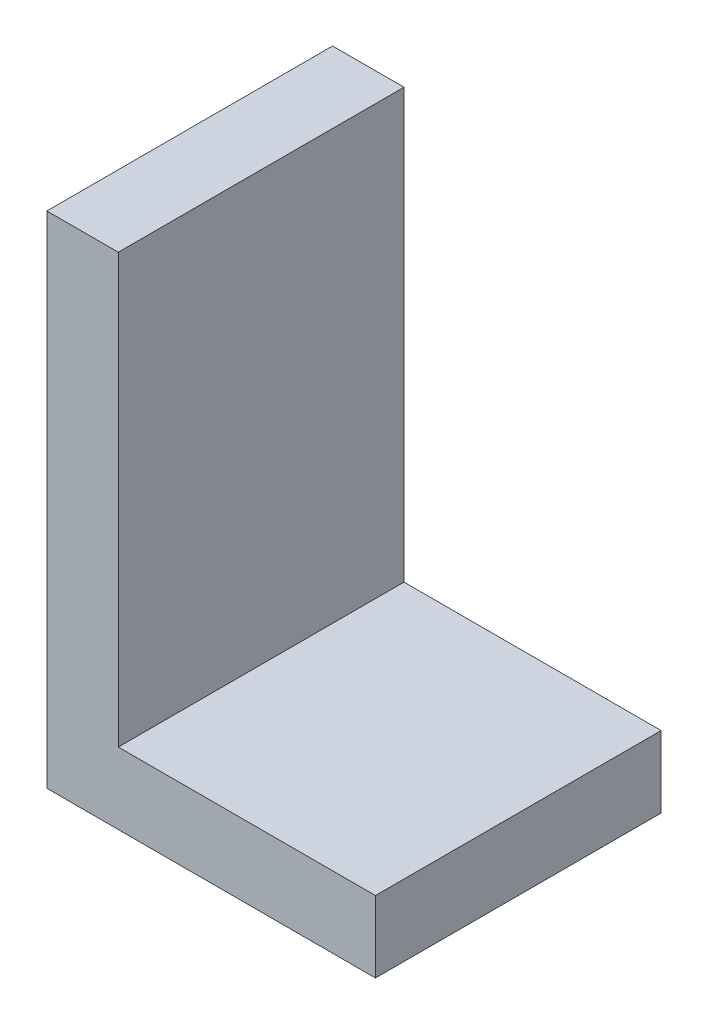
ISO-10303-21;
HEADER;
FILE_DESCRIPTION(('STEP AP214'),'2;1');
FILE_NAME('part.step','',(''),(''),'','','');
FILE_SCHEMA(('AUTOMOTIVE_DESIGN { 1 0 10303 214 1 1 1 1 }'));
ENDSEC;
DATA;
#1=APPLICATION_CONTEXT('core data for automotive mechanical design processes');
#2=APPLICATION_PROTOCOL_DEFINITION('international standard','automotive_design',2000,#1);
#3=PRODUCT_CONTEXT('',#1,'mechanical');
#4=PRODUCT('Part','Part','',(#3));
#5=PRODUCT_RELATED_PRODUCT_CATEGORY('part','',(#4));
#6=PRODUCT_DEFINITION_FORMATION('','',#4);
#7=PRODUCT_DEFINITION_CONTEXT('part definition',#1,'design');
#8=PRODUCT_DEFINITION('design','',#6,#7);
#9=PRODUCT_DEFINITION_SHAPE('','',#8);
#10=(LENGTH_UNIT() NAMED_UNIT(*) SI_UNIT(.MILLI.,.METRE.));
#11=(NAMED_UNIT(*) PLANE_ANGLE_UNIT() SI_UNIT($,.RADIAN.));
#12=(NAMED_UNIT(*) SI_UNIT($,.STERADIAN.) SOLID_ANGLE_UNIT());
#13=UNCERTAINTY_MEASURE_WITH_UNIT(LENGTH_MEASURE(1.E-05),#10,'distance_accuracy_value','');
#14=(GEOMETRIC_REPRESENTATION_CONTEXT(3) GLOBAL_UNCERTAINTY_ASSIGNED_CONTEXT((#13)) GLOBAL_UNIT_ASSIGNED_CONTEXT((#10,
#11,#12)) REPRESENTATION_CONTEXT('',''));
#15=CARTESIAN_POINT('',(0.,0.,0.));
#16=DIRECTION('',(0.,0.,1.));
#17=DIRECTION('',(1.,0.,0.));
#18=AXIS2_PLACEMENT_3D('',#15,#16,#17);
#19=CARTESIAN_POINT('',(460.,0.,400.));
#20=DIRECTION('',(0.,1.,0.));
#21=DIRECTION('',(-1.,0.,0.));
#22=AXIS2_PLACEMENT_3D('',#19,#20,#21);
#23=PLANE('',#22);
#24=DIRECTION('',(1.,0.,0.));
#25=VECTOR('',#24,1.);
#26=CARTESIAN_POINT('',(460.,0.,0.));
#27=LINE('',#26,#25);
#28=CARTESIAN_POINT('',(0.,0.,0.));
#29=VERTEX_POINT('',#28);
#30=CARTESIAN_POINT('',(460.,0.,0.));
#31=VERTEX_POINT('',#30);
#32=EDGE_CURVE('E117',#29,#31,#27,.T.);
#33=ORIENTED_EDGE('',*,*,#32,.T.);
#34=DIRECTION('',(0.,0.,-1.));
#35=VECTOR('',#34,1.);
#36=CARTESIAN_POINT('',(460.,0.,400.));
#37=LINE('',#36,#35);
#38=CARTESIAN_POINT('',(460.,0.,400.));
#39=VERTEX_POINT('',#38);
#40=EDGE_CURVE('E11',#39,#31,#37,.T.);
#41=ORIENTED_EDGE('',*,*,#40,.F.);
#42=DIRECTION('',(1.,0.,0.));
#43=VECTOR('',#42,1.);
#44=CARTESIAN_POINT('',(460.,0.,400.));
#45=LINE('',#44,#43);
#46=CARTESIAN_POINT('',(0.,0.,400.));
#47=VERTEX_POINT('',#46);
#48=EDGE_CURVE('E127',#47,#39,#45,.T.);
#49=ORIENTED_EDGE('',*,*,#48,.F.);
#50=DIRECTION('',(0.,0.,-1.));
#51=VECTOR('',#50,1.);
#52=CARTESIAN_POINT('',(0.,0.,400.));
#53=LINE('',#52,#51);
#54=EDGE_CURVE('E113',#47,#29,#53,.T.);
#55=ORIENTED_EDGE('',*,*,#54,.T.);
#56=EDGE_LOOP('',(#33,#41,#49,#55));
#57=FACE_BOUND('',#56,.T.);
#58=ADVANCED_FACE('F33',(#57),#23,.F.);
#59=CARTESIAN_POINT('',(460.,100.,400.));
#60=DIRECTION('',(-1.,0.,0.));
#61=DIRECTION('',(0.,0.,1.));
#62=AXIS2_PLACEMENT_3D('',#59,#60,#61);
#63=PLANE('',#62);
#64=DIRECTION('',(0.,1.,0.));
#65=VECTOR('',#64,1.);
#66=CARTESIAN_POINT('',(460.,100.,0.));
#67=LINE('',#66,#65);
#68=CARTESIAN_POINT('',(460.,100.,0.));
#69=VERTEX_POINT('',#68);
#70=EDGE_CURVE('E120',#31,#69,#67,.T.);
#71=ORIENTED_EDGE('',*,*,#70,.T.);
#72=DIRECTION('',(0.,0.,-1.));
#73=VECTOR('',#72,1.);
#74=CARTESIAN_POINT('',(460.,100.,400.));
#75=LINE('',#74,#73);
#76=CARTESIAN_POINT('',(460.,100.,400.));
#77=VERTEX_POINT('',#76);
#78=EDGE_CURVE('E41',#77,#69,#75,.T.);
#79=ORIENTED_EDGE('',*,*,#78,.F.);
#80=DIRECTION('',(0.,1.,0.));
#81=VECTOR('',#80,1.);
#82=CARTESIAN_POINT('',(460.,100.,400.));
#83=LINE('',#82,#81);
#84=EDGE_CURVE('E86',#39,#77,#83,.T.);
#85=ORIENTED_EDGE('',*,*,#84,.F.);
#86=ORIENTED_EDGE('',*,*,#40,.T.);
#87=EDGE_LOOP('',(#71,#79,#85,#86));
#88=FACE_BOUND('',#87,.T.);
#89=ADVANCED_FACE('F151',(#88),#63,.F.);
#90=CARTESIAN_POINT('',(100.,100.,400.));
#91=DIRECTION('',(0.,-1.,0.));
#92=DIRECTION('',(0.,0.,-1.));
#93=AXIS2_PLACEMENT_3D('',#90,#91,#92);
#94=PLANE('',#93);
#95=DIRECTION('',(-1.,0.,0.));
#96=VECTOR('',#95,1.);
#97=CARTESIAN_POINT('',(100.,100.,0.));
#98=LINE('',#97,#96);
#99=CARTESIAN_POINT('',(100.,100.,0.));
#100=VERTEX_POINT('',#99);
#101=EDGE_CURVE('E122',#69,#100,#98,.T.);
#102=ORIENTED_EDGE('',*,*,#101,.T.);
#103=DIRECTION('',(0.,0.,-1.));
#104=VECTOR('',#103,1.);
#105=CARTESIAN_POINT('',(100.,100.,400.));
#106=LINE('',#105,#104);
#107=CARTESIAN_POINT('',(100.,100.,400.));
#108=VERTEX_POINT('',#107);
#109=EDGE_CURVE('E108',#108,#100,#106,.T.);
#110=ORIENTED_EDGE('',*,*,#109,.F.);
#111=DIRECTION('',(-1.,0.,0.));
#112=VECTOR('',#111,1.);
#113=CARTESIAN_POINT('',(100.,100.,400.));
#114=LINE('',#113,#112);
#115=EDGE_CURVE('E99',#77,#108,#114,.T.);
#116=ORIENTED_EDGE('',*,*,#115,.F.);
#117=ORIENTED_EDGE('',*,*,#78,.T.);
#118=EDGE_LOOP('',(#102,#110,#116,#117));
#119=FACE_BOUND('',#118,.T.);
#120=ADVANCED_FACE('F133',(#119),#94,.F.);
#121=CARTESIAN_POINT('',(100.,700.,400.));
#122=DIRECTION('',(-1.,0.,0.));
#123=DIRECTION('',(0.,-1.,0.));
#124=AXIS2_PLACEMENT_3D('',#121,#122,#123);
#125=PLANE('',#124);
#126=DIRECTION('',(0.,1.,0.));
#127=VECTOR('',#126,1.);
#128=CARTESIAN_POINT('',(100.,700.,0.));
#129=LINE('',#128,#127);
#130=CARTESIAN_POINT('',(100.,700.,0.));
#131=VERTEX_POINT('',#130);
#132=EDGE_CURVE('E107',#100,#131,#129,.T.);
#133=ORIENTED_EDGE('',*,*,#132,.T.);
#134=DIRECTION('',(0.,0.,-1.));
#135=VECTOR('',#134,1.);
#136=CARTESIAN_POINT('',(100.,700.,400.));
#137=LINE('',#136,#135);
#138=CARTESIAN_POINT('',(100.,700.,400.));
#139=VERTEX_POINT('',#138);
#140=EDGE_CURVE('E104',#139,#131,#137,.T.);
#141=ORIENTED_EDGE('',*,*,#140,.F.);
#142=DIRECTION('',(0.,1.,0.));
#143=VECTOR('',#142,1.);
#144=CARTESIAN_POINT('',(100.,700.,400.));
#145=LINE('',#144,#143);
#146=EDGE_CURVE('E93',#108,#139,#145,.T.);
#147=ORIENTED_EDGE('',*,*,#146,.F.);
#148=ORIENTED_EDGE('',*,*,#109,.T.);
#149=EDGE_LOOP('',(#133,#141,#147,#148));
#150=FACE_BOUND('',#149,.T.);
#151=ADVANCED_FACE('F105',(#150),#125,.F.);
#152=CARTESIAN_POINT('',(0.,700.,400.));
#153=DIRECTION('',(0.,-1.,0.));
#154=DIRECTION('',(0.,0.,-1.));
#155=AXIS2_PLACEMENT_3D('',#152,#153,#154);
#156=PLANE('',#155);
#157=DIRECTION('',(-1.,0.,0.));
#158=VECTOR('',#157,1.);
#159=CARTESIAN_POINT('',(0.,700.,0.));
#160=LINE('',#159,#158);
#161=CARTESIAN_POINT('',(0.,700.,0.));
#162=VERTEX_POINT('',#161);
#163=EDGE_CURVE('E72',#131,#162,#160,.T.);
#164=ORIENTED_EDGE('',*,*,#163,.T.);
#165=DIRECTION('',(0.,0.,-1.));
#166=VECTOR('',#165,1.);
#167=CARTESIAN_POINT('',(0.,700.,400.));
#168=LINE('',#167,#166);
#169=CARTESIAN_POINT('',(0.,700.,400.));
#170=VERTEX_POINT('',#169);
#171=EDGE_CURVE('E109',#170,#162,#168,.T.);
#172=ORIENTED_EDGE('',*,*,#171,.F.);
#173=DIRECTION('',(-1.,0.,0.));
#174=VECTOR('',#173,1.);
#175=CARTESIAN_POINT('',(0.,700.,400.));
#176=LINE('',#175,#174);
#177=EDGE_CURVE('E97',#139,#170,#176,.T.);
#178=ORIENTED_EDGE('',*,*,#177,.F.);
#179=ORIENTED_EDGE('',*,*,#140,.T.);
#180=EDGE_LOOP('',(#164,#172,#178,#179));
#181=FACE_BOUND('',#180,.T.);
#182=ADVANCED_FACE('F111',(#181),#156,.F.);
#183=CARTESIAN_POINT('',(0.,0.,400.));
#184=DIRECTION('',(1.,0.,0.));
#185=DIRECTION('',(0.,0.,-1.));
#186=AXIS2_PLACEMENT_3D('',#183,#184,#185);
#187=PLANE('',#186);
#188=DIRECTION('',(0.,-1.,0.));
#189=VECTOR('',#188,1.);
#190=CARTESIAN_POINT('',(0.,0.,0.));
#191=LINE('',#190,#189);
#192=EDGE_CURVE('E78',#162,#29,#191,.T.);
#193=ORIENTED_EDGE('',*,*,#192,.T.);
#194=ORIENTED_EDGE('',*,*,#54,.F.);
#195=DIRECTION('',(0.,-1.,0.));
#196=VECTOR('',#195,1.);
#197=CARTESIAN_POINT('',(0.,0.,400.));
#198=LINE('',#197,#196);
#199=EDGE_CURVE('E49',#170,#47,#198,.T.);
#200=ORIENTED_EDGE('',*,*,#199,.F.);
#201=ORIENTED_EDGE('',*,*,#171,.T.);
#202=EDGE_LOOP('',(#193,#194,#200,#201));
#203=FACE_BOUND('',#202,.T.);
#204=ADVANCED_FACE('F140',(#203),#187,.F.);
#205=CARTESIAN_POINT('',(0.,0.,400.));
#206=DIRECTION('',(0.,0.,-1.));
#207=DIRECTION('',(-1.,0.,0.));
#208=AXIS2_PLACEMENT_3D('',#205,#206,#207);
#209=PLANE('',#208);
#210=ORIENTED_EDGE('',*,*,#48,.T.);
#211=ORIENTED_EDGE('',*,*,#84,.T.);
#212=ORIENTED_EDGE('',*,*,#115,.T.);
#213=ORIENTED_EDGE('',*,*,#146,.T.);
#214=ORIENTED_EDGE('',*,*,#177,.T.);
#215=ORIENTED_EDGE('',*,*,#199,.T.);
#216=EDGE_LOOP('',(#210,#211,#212,#213,#214,#215));
#217=FACE_BOUND('',#216,.T.);
#218=ADVANCED_FACE('F95',(#217),#209,.F.);
#219=CARTESIAN_POINT('',(0.,0.,0.));
#220=DIRECTION('',(0.,0.,-1.));
#221=DIRECTION('',(-1.,0.,0.));
#222=AXIS2_PLACEMENT_3D('',#219,#220,#221);
#223=PLANE('',#222);
#224=ORIENTED_EDGE('',*,*,#32,.F.);
#225=ORIENTED_EDGE('',*,*,#192,.F.);
#226=ORIENTED_EDGE('',*,*,#163,.F.);
#227=ORIENTED_EDGE('',*,*,#132,.F.);
#228=ORIENTED_EDGE('',*,*,#101,.F.);
#229=ORIENTED_EDGE('',*,*,#70,.F.);
#230=EDGE_LOOP('',(#224,#225,#226,#227,#228,#229));
#231=FACE_BOUND('',#230,.T.);
#232=ADVANCED_FACE('F136',(#231),#223,.T.);
#233=CLOSED_SHELL('',(#58,#89,#120,#151,#182,#204,#218,#232));
#234=MANIFOLD_SOLID_BREP('B2',#233);
#235=ADVANCED_BREP_SHAPE_REPRESENTATION('',(#18,#234),#14);
#236=SHAPE_DEFINITION_REPRESENTATION(#9,#235);
ENDSEC;
END-ISO-10303-21;
